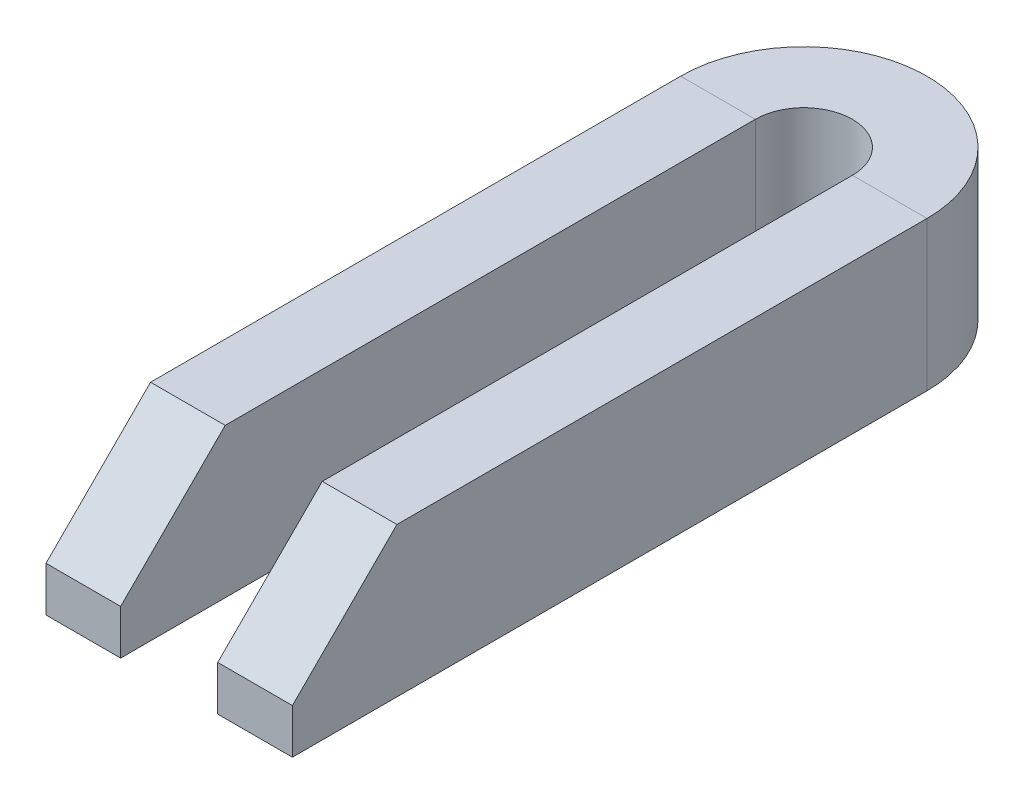
ISO-10303-21;
HEADER;
FILE_DESCRIPTION(('STEP AP214'),'2;1');
FILE_NAME('part.step','',(''),(''),'','','');
FILE_SCHEMA(('AUTOMOTIVE_DESIGN { 1 0 10303 214 1 1 1 1 }'));
ENDSEC;
DATA;
#1=APPLICATION_CONTEXT('core data for automotive mechanical design processes');
#2=APPLICATION_PROTOCOL_DEFINITION('international standard','automotive_design',2000,#1);
#3=PRODUCT_CONTEXT('',#1,'mechanical');
#4=PRODUCT('Part','Part','',(#3));
#5=PRODUCT_RELATED_PRODUCT_CATEGORY('part','',(#4));
#6=PRODUCT_DEFINITION_FORMATION('','',#4);
#7=PRODUCT_DEFINITION_CONTEXT('part definition',#1,'design');
#8=PRODUCT_DEFINITION('design','',#6,#7);
#9=PRODUCT_DEFINITION_SHAPE('','',#8);
#10=(LENGTH_UNIT() NAMED_UNIT(*) SI_UNIT(.MILLI.,.METRE.));
#11=(NAMED_UNIT(*) PLANE_ANGLE_UNIT() SI_UNIT($,.RADIAN.));
#12=(NAMED_UNIT(*) SI_UNIT($,.STERADIAN.) SOLID_ANGLE_UNIT());
#13=UNCERTAINTY_MEASURE_WITH_UNIT(LENGTH_MEASURE(1.E-05),#10,'distance_accuracy_value','');
#14=(GEOMETRIC_REPRESENTATION_CONTEXT(3) GLOBAL_UNCERTAINTY_ASSIGNED_CONTEXT((#13)) GLOBAL_UNIT_ASSIGNED_CONTEXT((#10,
#11,#12)) REPRESENTATION_CONTEXT('',''));
#15=CARTESIAN_POINT('',(0.,0.,0.));
#16=DIRECTION('',(0.,0.,1.));
#17=DIRECTION('',(1.,0.,0.));
#18=AXIS2_PLACEMENT_3D('',#15,#16,#17);
#19=CARTESIAN_POINT('',(0.,0.,0.));
#20=DIRECTION('',(0.,0.,1.));
#21=DIRECTION('',(1.,0.,0.));
#22=AXIS2_PLACEMENT_3D('',#19,#20,#21);
#23=PLANE('',#22);
#24=DIRECTION('',(0.,1.,0.));
#25=VECTOR('',#24,1.);
#26=CARTESIAN_POINT('',(-13.,0.,0.));
#27=LINE('',#26,#25);
#28=CARTESIAN_POINT('',(-13.,0.,0.));
#29=VERTEX_POINT('',#28);
#30=CARTESIAN_POINT('',(-13.,12.,0.));
#31=VERTEX_POINT('',#30);
#32=EDGE_CURVE('E119',#29,#31,#27,.T.);
#33=ORIENTED_EDGE('',*,*,#32,.T.);
#34=DIRECTION('',(-1.,0.,0.));
#35=VECTOR('',#34,1.);
#36=CARTESIAN_POINT('',(-33.,12.,0.));
#37=LINE('',#36,#35);
#38=CARTESIAN_POINT('',(-33.,12.,0.));
#39=VERTEX_POINT('',#38);
#40=EDGE_CURVE('E115',#31,#39,#37,.T.);
#41=ORIENTED_EDGE('',*,*,#40,.T.);
#42=DIRECTION('',(0.,-1.,0.));
#43=VECTOR('',#42,1.);
#44=CARTESIAN_POINT('',(-33.,40.,0.));
#45=LINE('',#44,#43);
#46=CARTESIAN_POINT('',(-33.,0.,0.));
#47=VERTEX_POINT('',#46);
#48=EDGE_CURVE('E109',#39,#47,#45,.T.);
#49=ORIENTED_EDGE('',*,*,#48,.T.);
#50=DIRECTION('',(1.,0.,0.));
#51=VECTOR('',#50,1.);
#52=CARTESIAN_POINT('',(-33.,0.,0.));
#53=LINE('',#52,#51);
#54=EDGE_CURVE('E112',#47,#29,#53,.T.);
#55=ORIENTED_EDGE('',*,*,#54,.T.);
#56=EDGE_LOOP('',(#33,#41,#49,#55));
#57=FACE_BOUND('',#56,.T.);
#58=ADVANCED_FACE('F32',(#57),#23,.T.);
#59=CARTESIAN_POINT('',(0.,0.,0.));
#60=DIRECTION('',(0.,0.,-1.));
#61=DIRECTION('',(-1.,0.,0.));
#62=AXIS2_PLACEMENT_3D('',#59,#60,#61);
#63=PLANE('',#62);
#64=DIRECTION('',(0.,-1.,0.));
#65=VECTOR('',#64,1.);
#66=CARTESIAN_POINT('',(33.,40.,0.));
#67=LINE('',#66,#65);
#68=CARTESIAN_POINT('',(33.,11.9999999999999,0.));
#69=VERTEX_POINT('',#68);
#70=CARTESIAN_POINT('',(33.,0.,0.));
#71=VERTEX_POINT('',#70);
#72=EDGE_CURVE('E185',#69,#71,#67,.T.);
#73=ORIENTED_EDGE('',*,*,#72,.F.);
#74=DIRECTION('',(-1.,0.,0.));
#75=VECTOR('',#74,1.);
#76=CARTESIAN_POINT('',(0.,11.9999999999999,0.));
#77=LINE('',#76,#75);
#78=CARTESIAN_POINT('',(13.,11.9999999999999,0.));
#79=VERTEX_POINT('',#78);
#80=EDGE_CURVE('E40',#69,#79,#77,.T.);
#81=ORIENTED_EDGE('',*,*,#80,.T.);
#82=DIRECTION('',(0.,1.,0.));
#83=VECTOR('',#82,1.);
#84=CARTESIAN_POINT('',(13.,0.,0.));
#85=LINE('',#84,#83);
#86=CARTESIAN_POINT('',(13.,0.,0.));
#87=VERTEX_POINT('',#86);
#88=EDGE_CURVE('E154',#87,#79,#85,.T.);
#89=ORIENTED_EDGE('',*,*,#88,.F.);
#90=DIRECTION('',(-1.,0.,0.));
#91=VECTOR('',#90,1.);
#92=CARTESIAN_POINT('',(33.,0.,0.));
#93=LINE('',#92,#91);
#94=EDGE_CURVE('E148',#71,#87,#93,.T.);
#95=ORIENTED_EDGE('',*,*,#94,.F.);
#96=EDGE_LOOP('',(#73,#81,#89,#95));
#97=FACE_BOUND('',#96,.T.);
#98=ADVANCED_FACE('F238',(#97),#63,.F.);
#99=CARTESIAN_POINT('',(-33.,0.,0.));
#100=DIRECTION('',(0.,1.,0.));
#101=DIRECTION('',(0.,0.,1.));
#102=AXIS2_PLACEMENT_3D('',#99,#100,#101);
#103=PLANE('',#102);
#104=DIRECTION('',(0.,0.,-1.));
#105=VECTOR('',#104,1.);
#106=CARTESIAN_POINT('',(-13.,0.,0.));
#107=LINE('',#106,#105);
#108=CARTESIAN_POINT('',(-13.,0.,-170.));
#109=VERTEX_POINT('',#108);
#110=EDGE_CURVE('E126',#29,#109,#107,.T.);
#111=ORIENTED_EDGE('',*,*,#110,.F.);
#112=ORIENTED_EDGE('',*,*,#54,.F.);
#113=DIRECTION('',(0.,0.,-1.));
#114=VECTOR('',#113,1.);
#115=CARTESIAN_POINT('',(-33.,0.,0.));
#116=LINE('',#115,#114);
#117=CARTESIAN_POINT('',(-33.,0.,-170.));
#118=VERTEX_POINT('',#117);
#119=EDGE_CURVE('E118',#47,#118,#116,.T.);
#120=ORIENTED_EDGE('',*,*,#119,.T.);
#121=DIRECTION('',(1.,0.,0.));
#122=VECTOR('',#121,1.);
#123=CARTESIAN_POINT('',(-33.,0.,-170.));
#124=LINE('',#123,#122);
#125=EDGE_CURVE('E133',#118,#109,#124,.T.);
#126=ORIENTED_EDGE('',*,*,#125,.T.);
#127=EDGE_LOOP('',(#111,#112,#120,#126));
#128=FACE_BOUND('',#127,.T.);
#129=ADVANCED_FACE('F123',(#128),#103,.F.);
#130=CARTESIAN_POINT('',(-13.,0.,0.));
#131=DIRECTION('',(-1.,0.,0.));
#132=DIRECTION('',(0.,0.,1.));
#133=AXIS2_PLACEMENT_3D('',#130,#131,#132);
#134=PLANE('',#133);
#135=DIRECTION('',(0.,0.,-1.));
#136=VECTOR('',#135,1.);
#137=CARTESIAN_POINT('',(-13.,40.,0.));
#138=LINE('',#137,#136);
#139=CARTESIAN_POINT('',(-13.,40.,-28.0000000000001));
#140=VERTEX_POINT('',#139);
#141=CARTESIAN_POINT('',(-13.,40.,-170.));
#142=VERTEX_POINT('',#141);
#143=EDGE_CURVE('E162',#140,#142,#138,.T.);
#144=ORIENTED_EDGE('',*,*,#143,.F.);
#145=DIRECTION('',(0.,-0.707106781186546,0.707106781186549));
#146=VECTOR('',#145,1.);
#147=CARTESIAN_POINT('',(-13.,12.,0.));
#148=LINE('',#147,#146);
#149=EDGE_CURVE('E196',#140,#31,#148,.T.);
#150=ORIENTED_EDGE('',*,*,#149,.T.);
#151=ORIENTED_EDGE('',*,*,#32,.F.);
#152=ORIENTED_EDGE('',*,*,#110,.T.);
#153=DIRECTION('',(0.,1.,0.));
#154=VECTOR('',#153,1.);
#155=CARTESIAN_POINT('',(-13.,0.,-170.));
#156=LINE('',#155,#154);
#157=EDGE_CURVE('E159',#109,#142,#156,.T.);
#158=ORIENTED_EDGE('',*,*,#157,.T.);
#159=EDGE_LOOP('',(#144,#150,#151,#152,#158));
#160=FACE_BOUND('',#159,.T.);
#161=ADVANCED_FACE('F256',(#160),#134,.F.);
#162=CARTESIAN_POINT('',(-13.,40.,0.));
#163=DIRECTION('',(0.,-1.,0.));
#164=DIRECTION('',(1.,0.,0.));
#165=AXIS2_PLACEMENT_3D('',#162,#163,#164);
#166=PLANE('',#165);
#167=DIRECTION('',(0.,0.,-1.));
#168=VECTOR('',#167,1.);
#169=CARTESIAN_POINT('',(-33.,40.,0.));
#170=LINE('',#169,#168);
#171=CARTESIAN_POINT('',(-33.,40.,-28.0000000000001));
#172=VERTEX_POINT('',#171);
#173=CARTESIAN_POINT('',(-33.,40.,-170.));
#174=VERTEX_POINT('',#173);
#175=EDGE_CURVE('E178',#172,#174,#170,.T.);
#176=ORIENTED_EDGE('',*,*,#175,.F.);
#177=DIRECTION('',(1.,0.,0.));
#178=VECTOR('',#177,1.);
#179=CARTESIAN_POINT('',(-13.,40.,-28.0000000000001));
#180=LINE('',#179,#178);
#181=EDGE_CURVE('E194',#172,#140,#180,.T.);
#182=ORIENTED_EDGE('',*,*,#181,.T.);
#183=ORIENTED_EDGE('',*,*,#143,.T.);
#184=DIRECTION('',(-1.,0.,0.));
#185=VECTOR('',#184,1.);
#186=CARTESIAN_POINT('',(-13.,40.,-170.));
#187=LINE('',#186,#185);
#188=EDGE_CURVE('E164',#142,#174,#187,.T.);
#189=ORIENTED_EDGE('',*,*,#188,.T.);
#190=EDGE_LOOP('',(#176,#182,#183,#189));
#191=FACE_BOUND('',#190,.T.);
#192=ADVANCED_FACE('F263',(#191),#166,.F.);
#193=CARTESIAN_POINT('',(-33.,40.,0.));
#194=DIRECTION('',(1.,0.,0.));
#195=DIRECTION('',(0.,1.,0.));
#196=AXIS2_PLACEMENT_3D('',#193,#194,#195);
#197=PLANE('',#196);
#198=ORIENTED_EDGE('',*,*,#48,.F.);
#199=DIRECTION('',(0.,0.707106781186546,-0.707106781186549));
#200=VECTOR('',#199,1.);
#201=CARTESIAN_POINT('',(-33.,12.,0.));
#202=LINE('',#201,#200);
#203=EDGE_CURVE('E192',#39,#172,#202,.T.);
#204=ORIENTED_EDGE('',*,*,#203,.T.);
#205=ORIENTED_EDGE('',*,*,#175,.T.);
#206=DIRECTION('',(0.,-1.,0.));
#207=VECTOR('',#206,1.);
#208=CARTESIAN_POINT('',(-33.,40.,-170.));
#209=LINE('',#208,#207);
#210=EDGE_CURVE('E131',#174,#118,#209,.T.);
#211=ORIENTED_EDGE('',*,*,#210,.T.);
#212=ORIENTED_EDGE('',*,*,#119,.F.);
#213=EDGE_LOOP('',(#198,#204,#205,#211,#212));
#214=FACE_BOUND('',#213,.T.);
#215=ADVANCED_FACE('F129',(#214),#197,.F.);
#216=CARTESIAN_POINT('',(-33.,0.,-170.));
#217=DIRECTION('',(0.,1.,0.));
#218=DIRECTION('',(0.,0.,1.));
#219=AXIS2_PLACEMENT_3D('',#216,#217,#218);
#220=PLANE('',#219);
#221=CARTESIAN_POINT('',(0.,0.,-170.));
#222=DIRECTION('',(0.,-1.,0.));
#223=DIRECTION('',(-1.,0.,0.));
#224=AXIS2_PLACEMENT_3D('',#221,#222,#223);
#225=CIRCLE('',#224,13.);
#226=CARTESIAN_POINT('',(13.,0.,-170.));
#227=VERTEX_POINT('',#226);
#228=EDGE_CURVE('E141',#109,#227,#225,.T.);
#229=ORIENTED_EDGE('',*,*,#228,.F.);
#230=ORIENTED_EDGE('',*,*,#125,.F.);
#231=CARTESIAN_POINT('',(0.,0.,-170.));
#232=DIRECTION('',(0.,-1.,0.));
#233=DIRECTION('',(-1.,0.,0.));
#234=AXIS2_PLACEMENT_3D('',#231,#232,#233);
#235=CIRCLE('',#234,33.);
#236=CARTESIAN_POINT('',(33.,0.,-170.));
#237=VERTEX_POINT('',#236);
#238=EDGE_CURVE('E142',#118,#237,#235,.T.);
#239=ORIENTED_EDGE('',*,*,#238,.T.);
#240=DIRECTION('',(-1.,0.,0.));
#241=VECTOR('',#240,1.);
#242=CARTESIAN_POINT('',(33.,0.,-170.));
#243=LINE('',#242,#241);
#244=EDGE_CURVE('E138',#237,#227,#243,.T.);
#245=ORIENTED_EDGE('',*,*,#244,.T.);
#246=EDGE_LOOP('',(#229,#230,#239,#245));
#247=FACE_BOUND('',#246,.T.);
#248=ADVANCED_FACE('F278',(#247),#220,.F.);
#249=CARTESIAN_POINT('',(0.,0.,-170.));
#250=DIRECTION('',(0.,-1.,0.));
#251=DIRECTION('',(0.,0.,-1.));
#252=AXIS2_PLACEMENT_3D('',#249,#250,#251);
#253=CYLINDRICAL_SURFACE('',#252,13.);
#254=CARTESIAN_POINT('',(0.,40.,-170.));
#255=DIRECTION('',(0.,-1.,0.));
#256=DIRECTION('',(-1.,0.,0.));
#257=AXIS2_PLACEMENT_3D('',#254,#255,#256);
#258=CIRCLE('',#257,13.);
#259=CARTESIAN_POINT('',(13.,40.,-170.));
#260=VERTEX_POINT('',#259);
#261=EDGE_CURVE('E167',#142,#260,#258,.T.);
#262=ORIENTED_EDGE('',*,*,#261,.F.);
#263=ORIENTED_EDGE('',*,*,#157,.F.);
#264=ORIENTED_EDGE('',*,*,#228,.T.);
#265=DIRECTION('',(0.,1.,0.));
#266=VECTOR('',#265,1.);
#267=CARTESIAN_POINT('',(13.,0.,-170.));
#268=LINE('',#267,#266);
#269=EDGE_CURVE('E145',#227,#260,#268,.T.);
#270=ORIENTED_EDGE('',*,*,#269,.T.);
#271=EDGE_LOOP('',(#262,#263,#264,#270));
#272=FACE_BOUND('',#271,.T.);
#273=ADVANCED_FACE('F220',(#272),#253,.F.);
#274=CARTESIAN_POINT('',(-13.,40.,-170.));
#275=DIRECTION('',(0.,-1.,0.));
#276=DIRECTION('',(0.,0.,-1.));
#277=AXIS2_PLACEMENT_3D('',#274,#275,#276);
#278=PLANE('',#277);
#279=CARTESIAN_POINT('',(0.,40.,-170.));
#280=DIRECTION('',(0.,-1.,0.));
#281=DIRECTION('',(-1.,0.,0.));
#282=AXIS2_PLACEMENT_3D('',#279,#280,#281);
#283=CIRCLE('',#282,33.);
#284=CARTESIAN_POINT('',(33.,40.,-170.));
#285=VERTEX_POINT('',#284);
#286=EDGE_CURVE('E182',#174,#285,#283,.T.);
#287=ORIENTED_EDGE('',*,*,#286,.F.);
#288=ORIENTED_EDGE('',*,*,#188,.F.);
#289=ORIENTED_EDGE('',*,*,#261,.T.);
#290=DIRECTION('',(1.,0.,0.));
#291=VECTOR('',#290,1.);
#292=CARTESIAN_POINT('',(13.,40.,-170.));
#293=LINE('',#292,#291);
#294=EDGE_CURVE('E170',#260,#285,#293,.T.);
#295=ORIENTED_EDGE('',*,*,#294,.T.);
#296=EDGE_LOOP('',(#287,#288,#289,#295));
#297=FACE_BOUND('',#296,.T.);
#298=ADVANCED_FACE('F215',(#297),#278,.F.);
#299=CARTESIAN_POINT('',(0.,0.,-170.));
#300=DIRECTION('',(0.,-1.,0.));
#301=DIRECTION('',(0.,0.,-1.));
#302=AXIS2_PLACEMENT_3D('',#299,#300,#301);
#303=CYLINDRICAL_SURFACE('',#302,33.);
#304=DIRECTION('',(0.,-1.,0.));
#305=VECTOR('',#304,1.);
#306=CARTESIAN_POINT('',(33.,40.,-170.));
#307=LINE('',#306,#305);
#308=EDGE_CURVE('E157',#285,#237,#307,.T.);
#309=ORIENTED_EDGE('',*,*,#308,.T.);
#310=ORIENTED_EDGE('',*,*,#238,.F.);
#311=ORIENTED_EDGE('',*,*,#210,.F.);
#312=ORIENTED_EDGE('',*,*,#286,.T.);
#313=EDGE_LOOP('',(#309,#310,#311,#312));
#314=FACE_BOUND('',#313,.T.);
#315=ADVANCED_FACE('F212',(#314),#303,.T.);
#316=CARTESIAN_POINT('',(33.,0.,-170.));
#317=DIRECTION('',(0.,1.,0.));
#318=DIRECTION('',(0.,0.,1.));
#319=AXIS2_PLACEMENT_3D('',#316,#317,#318);
#320=PLANE('',#319);
#321=DIRECTION('',(0.,0.,1.));
#322=VECTOR('',#321,1.);
#323=CARTESIAN_POINT('',(13.,0.,-170.));
#324=LINE('',#323,#322);
#325=EDGE_CURVE('E150',#227,#87,#324,.T.);
#326=ORIENTED_EDGE('',*,*,#325,.F.);
#327=ORIENTED_EDGE('',*,*,#244,.F.);
#328=DIRECTION('',(0.,0.,1.));
#329=VECTOR('',#328,1.);
#330=CARTESIAN_POINT('',(33.,0.,-170.));
#331=LINE('',#330,#329);
#332=EDGE_CURVE('E151',#237,#71,#331,.T.);
#333=ORIENTED_EDGE('',*,*,#332,.T.);
#334=ORIENTED_EDGE('',*,*,#94,.T.);
#335=EDGE_LOOP('',(#326,#327,#333,#334));
#336=FACE_BOUND('',#335,.T.);
#337=ADVANCED_FACE('F303',(#336),#320,.F.);
#338=CARTESIAN_POINT('',(13.,0.,-170.));
#339=DIRECTION('',(1.,0.,0.));
#340=DIRECTION('',(0.,0.,-1.));
#341=AXIS2_PLACEMENT_3D('',#338,#339,#340);
#342=PLANE('',#341);
#343=ORIENTED_EDGE('',*,*,#88,.T.);
#344=DIRECTION('',(0.,-0.707106781186549,0.707106781186547));
#345=VECTOR('',#344,1.);
#346=CARTESIAN_POINT('',(13.,40.,-28.));
#347=LINE('',#346,#345);
#348=CARTESIAN_POINT('',(13.,40.,-28.));
#349=VERTEX_POINT('',#348);
#350=EDGE_CURVE('E11',#79,#349,#347,.F.);
#351=ORIENTED_EDGE('',*,*,#350,.T.);
#352=DIRECTION('',(0.,0.,1.));
#353=VECTOR('',#352,1.);
#354=CARTESIAN_POINT('',(13.,40.,-170.));
#355=LINE('',#354,#353);
#356=EDGE_CURVE('E172',#260,#349,#355,.T.);
#357=ORIENTED_EDGE('',*,*,#356,.F.);
#358=ORIENTED_EDGE('',*,*,#269,.F.);
#359=ORIENTED_EDGE('',*,*,#325,.T.);
#360=EDGE_LOOP('',(#343,#351,#357,#358,#359));
#361=FACE_BOUND('',#360,.T.);
#362=ADVANCED_FACE('F222',(#361),#342,.F.);
#363=CARTESIAN_POINT('',(13.,40.,-170.));
#364=DIRECTION('',(0.,-1.,0.));
#365=DIRECTION('',(1.,0.,0.));
#366=AXIS2_PLACEMENT_3D('',#363,#364,#365);
#367=PLANE('',#366);
#368=ORIENTED_EDGE('',*,*,#356,.T.);
#369=DIRECTION('',(1.,0.,0.));
#370=VECTOR('',#369,1.);
#371=CARTESIAN_POINT('',(13.,40.,-28.));
#372=LINE('',#371,#370);
#373=CARTESIAN_POINT('',(33.,40.,-28.));
#374=VERTEX_POINT('',#373);
#375=EDGE_CURVE('E198',#349,#374,#372,.T.);
#376=ORIENTED_EDGE('',*,*,#375,.T.);
#377=DIRECTION('',(0.,0.,1.));
#378=VECTOR('',#377,1.);
#379=CARTESIAN_POINT('',(33.,40.,-170.));
#380=LINE('',#379,#378);
#381=EDGE_CURVE('E175',#285,#374,#380,.T.);
#382=ORIENTED_EDGE('',*,*,#381,.F.);
#383=ORIENTED_EDGE('',*,*,#294,.F.);
#384=EDGE_LOOP('',(#368,#376,#382,#383));
#385=FACE_BOUND('',#384,.T.);
#386=ADVANCED_FACE('F203',(#385),#367,.F.);
#387=CARTESIAN_POINT('',(33.,40.,-170.));
#388=DIRECTION('',(-1.,0.,0.));
#389=DIRECTION('',(0.,-1.,0.));
#390=AXIS2_PLACEMENT_3D('',#387,#388,#389);
#391=PLANE('',#390);
#392=ORIENTED_EDGE('',*,*,#381,.T.);
#393=DIRECTION('',(0.,0.707106781186549,-0.707106781186547));
#394=VECTOR('',#393,1.);
#395=CARTESIAN_POINT('',(33.,40.,-28.));
#396=LINE('',#395,#394);
#397=EDGE_CURVE('E54',#374,#69,#396,.F.);
#398=ORIENTED_EDGE('',*,*,#397,.T.);
#399=ORIENTED_EDGE('',*,*,#72,.T.);
#400=ORIENTED_EDGE('',*,*,#332,.F.);
#401=ORIENTED_EDGE('',*,*,#308,.F.);
#402=EDGE_LOOP('',(#392,#398,#399,#400,#401));
#403=FACE_BOUND('',#402,.T.);
#404=ADVANCED_FACE('F208',(#403),#391,.F.);
#405=CARTESIAN_POINT('',(0.,12.,0.));
#406=DIRECTION('',(0.,0.707106781186549,0.707106781186546));
#407=DIRECTION('',(1.,0.,0.));
#408=AXIS2_PLACEMENT_3D('',#405,#406,#407);
#409=PLANE('',#408);
#410=ORIENTED_EDGE('',*,*,#149,.F.);
#411=ORIENTED_EDGE('',*,*,#181,.F.);
#412=ORIENTED_EDGE('',*,*,#203,.F.);
#413=ORIENTED_EDGE('',*,*,#40,.F.);
#414=EDGE_LOOP('',(#410,#411,#412,#413));
#415=FACE_BOUND('',#414,.T.);
#416=ADVANCED_FACE('F224',(#415),#409,.T.);
#417=CARTESIAN_POINT('',(13.,40.,-28.));
#418=DIRECTION('',(0.,-0.707106781186546,-0.707106781186548));
#419=DIRECTION('',(1.,0.,0.));
#420=AXIS2_PLACEMENT_3D('',#417,#418,#419);
#421=PLANE('',#420);
#422=ORIENTED_EDGE('',*,*,#350,.F.);
#423=ORIENTED_EDGE('',*,*,#80,.F.);
#424=ORIENTED_EDGE('',*,*,#397,.F.);
#425=ORIENTED_EDGE('',*,*,#375,.F.);
#426=EDGE_LOOP('',(#422,#423,#424,#425));
#427=FACE_BOUND('',#426,.T.);
#428=ADVANCED_FACE('F34',(#427),#421,.F.);
#429=CLOSED_SHELL('',(#58,#98,#129,#161,#192,#215,#248,#273,#298,#315,#337,#362,#386,#404,#416,#428));
#430=MANIFOLD_SOLID_BREP('B2',#429);
#431=ADVANCED_BREP_SHAPE_REPRESENTATION('',(#18,#430),#14);
#432=SHAPE_DEFINITION_REPRESENTATION(#9,#431);
ENDSEC;
END-ISO-10303-21;
